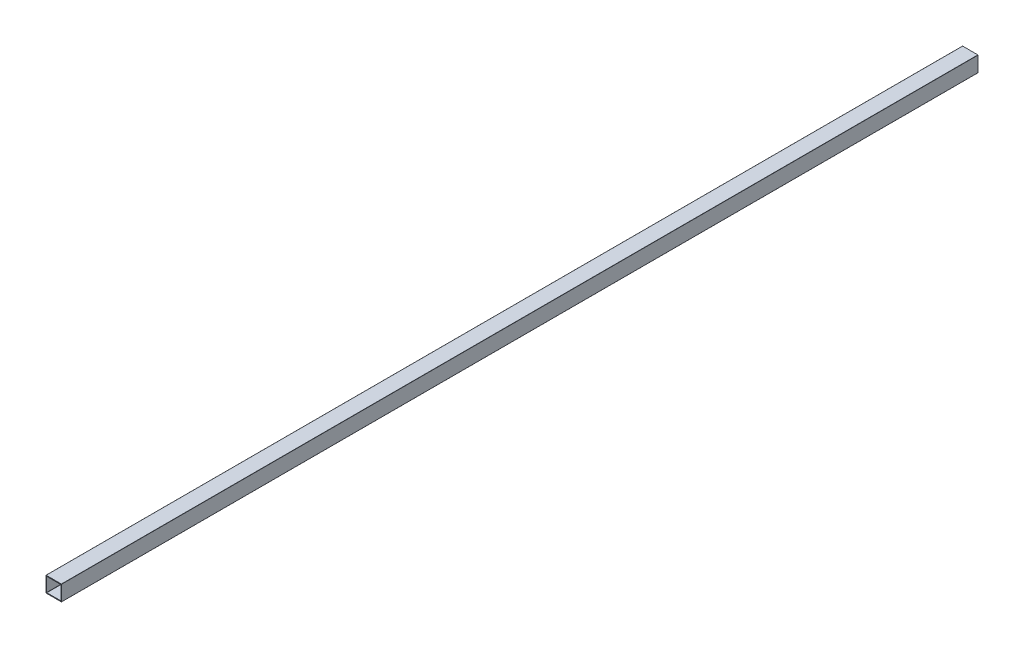
ISO-10303-21;
HEADER;
FILE_DESCRIPTION(('STEP AP214'),'2;1');
FILE_NAME('part.step','',(''),(''),'','','');
FILE_SCHEMA(('AUTOMOTIVE_DESIGN { 1 0 10303 214 1 1 1 1 }'));
ENDSEC;
DATA;
#1=APPLICATION_CONTEXT('core data for automotive mechanical design processes');
#2=APPLICATION_PROTOCOL_DEFINITION('international standard','automotive_design',2000,#1);
#3=PRODUCT_CONTEXT('',#1,'mechanical');
#4=PRODUCT('Part','Part','',(#3));
#5=PRODUCT_RELATED_PRODUCT_CATEGORY('part','',(#4));
#6=PRODUCT_DEFINITION_FORMATION('','',#4);
#7=PRODUCT_DEFINITION_CONTEXT('part definition',#1,'design');
#8=PRODUCT_DEFINITION('design','',#6,#7);
#9=PRODUCT_DEFINITION_SHAPE('','',#8);
#10=(LENGTH_UNIT() NAMED_UNIT(*) SI_UNIT(.MILLI.,.METRE.));
#11=(NAMED_UNIT(*) PLANE_ANGLE_UNIT() SI_UNIT($,.RADIAN.));
#12=(NAMED_UNIT(*) SI_UNIT($,.STERADIAN.) SOLID_ANGLE_UNIT());
#13=UNCERTAINTY_MEASURE_WITH_UNIT(LENGTH_MEASURE(1.E-05),#10,'distance_accuracy_value','');
#14=(GEOMETRIC_REPRESENTATION_CONTEXT(3) GLOBAL_UNCERTAINTY_ASSIGNED_CONTEXT((#13)) GLOBAL_UNIT_ASSIGNED_CONTEXT((#10,
#11,#12)) REPRESENTATION_CONTEXT('',''));
#15=CARTESIAN_POINT('',(0.,0.,0.));
#16=DIRECTION('',(0.,0.,1.));
#17=DIRECTION('',(1.,0.,0.));
#18=AXIS2_PLACEMENT_3D('',#15,#16,#17);
#19=CARTESIAN_POINT('',(50.8,-50.8,-6000.));
#20=DIRECTION('',(1.,0.,0.));
#21=DIRECTION('',(0.,0.,-1.));
#22=AXIS2_PLACEMENT_3D('',#19,#20,#21);
#23=PLANE('',#22);
#24=DIRECTION('',(0.,1.,0.));
#25=VECTOR('',#24,1.);
#26=CARTESIAN_POINT('',(50.8,-50.8,0.));
#27=LINE('',#26,#25);
#28=CARTESIAN_POINT('',(50.8,-49.8,0.));
#29=VERTEX_POINT('',#28);
#30=CARTESIAN_POINT('',(50.8,49.8,0.));
#31=VERTEX_POINT('',#30);
#32=EDGE_CURVE('E197',#29,#31,#27,.T.);
#33=ORIENTED_EDGE('',*,*,#32,.F.);
#34=DIRECTION('',(0.,0.,1.));
#35=VECTOR('',#34,1.);
#36=CARTESIAN_POINT('',(50.8,-49.8,-6000.));
#37=LINE('',#36,#35);
#38=CARTESIAN_POINT('',(50.8,-49.8,-6000.));
#39=VERTEX_POINT('',#38);
#40=EDGE_CURVE('E158',#29,#39,#37,.F.);
#41=ORIENTED_EDGE('',*,*,#40,.T.);
#42=DIRECTION('',(0.,1.,0.));
#43=VECTOR('',#42,1.);
#44=CARTESIAN_POINT('',(50.8,-50.8,-6000.));
#45=LINE('',#44,#43);
#46=CARTESIAN_POINT('',(50.8,49.8,-6000.));
#47=VERTEX_POINT('',#46);
#48=EDGE_CURVE('E185',#39,#47,#45,.T.);
#49=ORIENTED_EDGE('',*,*,#48,.T.);
#50=DIRECTION('',(0.,0.,1.));
#51=VECTOR('',#50,1.);
#52=CARTESIAN_POINT('',(50.8,49.8,-6000.));
#53=LINE('',#52,#51);
#54=EDGE_CURVE('E251',#47,#31,#53,.T.);
#55=ORIENTED_EDGE('',*,*,#54,.T.);
#56=EDGE_LOOP('',(#33,#41,#49,#55));
#57=FACE_BOUND('',#56,.T.);
#58=ADVANCED_FACE('F33',(#57),#23,.T.);
#59=CARTESIAN_POINT('',(-50.8,-50.8,-6000.));
#60=DIRECTION('',(0.,-1.,0.));
#61=DIRECTION('',(0.,0.,-1.));
#62=AXIS2_PLACEMENT_3D('',#59,#60,#61);
#63=PLANE('',#62);
#64=DIRECTION('',(1.,0.,0.));
#65=VECTOR('',#64,1.);
#66=CARTESIAN_POINT('',(-50.8,-50.8,0.));
#67=LINE('',#66,#65);
#68=CARTESIAN_POINT('',(-49.8,-50.8,0.));
#69=VERTEX_POINT('',#68);
#70=CARTESIAN_POINT('',(49.8,-50.8,0.));
#71=VERTEX_POINT('',#70);
#72=EDGE_CURVE('E189',#69,#71,#67,.T.);
#73=ORIENTED_EDGE('',*,*,#72,.F.);
#74=DIRECTION('',(0.,0.,1.));
#75=VECTOR('',#74,1.);
#76=CARTESIAN_POINT('',(-49.8,-50.8,-6000.));
#77=LINE('',#76,#75);
#78=CARTESIAN_POINT('',(-49.8,-50.8,-6000.));
#79=VERTEX_POINT('',#78);
#80=EDGE_CURVE('E238',#69,#79,#77,.F.);
#81=ORIENTED_EDGE('',*,*,#80,.T.);
#82=DIRECTION('',(1.,0.,0.));
#83=VECTOR('',#82,1.);
#84=CARTESIAN_POINT('',(-50.8,-50.8,-6000.));
#85=LINE('',#84,#83);
#86=CARTESIAN_POINT('',(49.8,-50.8,-6000.));
#87=VERTEX_POINT('',#86);
#88=EDGE_CURVE('E194',#79,#87,#85,.T.);
#89=ORIENTED_EDGE('',*,*,#88,.T.);
#90=DIRECTION('',(0.,0.,1.));
#91=VECTOR('',#90,1.);
#92=CARTESIAN_POINT('',(49.8,-50.8,-6000.));
#93=LINE('',#92,#91);
#94=EDGE_CURVE('E235',#87,#71,#93,.T.);
#95=ORIENTED_EDGE('',*,*,#94,.T.);
#96=EDGE_LOOP('',(#73,#81,#89,#95));
#97=FACE_BOUND('',#96,.T.);
#98=ADVANCED_FACE('F305',(#97),#63,.T.);
#99=CARTESIAN_POINT('',(-50.8,-50.8,-6000.));
#100=DIRECTION('',(-1.,0.,0.));
#101=DIRECTION('',(0.,0.,1.));
#102=AXIS2_PLACEMENT_3D('',#99,#100,#101);
#103=PLANE('',#102);
#104=DIRECTION('',(0.,-1.,0.));
#105=VECTOR('',#104,1.);
#106=CARTESIAN_POINT('',(-50.8,-50.8,-6000.));
#107=LINE('',#106,#105);
#108=CARTESIAN_POINT('',(-50.8,49.8,-6000.));
#109=VERTEX_POINT('',#108);
#110=CARTESIAN_POINT('',(-50.8,-49.8,-6000.));
#111=VERTEX_POINT('',#110);
#112=EDGE_CURVE('E191',#109,#111,#107,.T.);
#113=ORIENTED_EDGE('',*,*,#112,.T.);
#114=DIRECTION('',(0.,0.,1.));
#115=VECTOR('',#114,1.);
#116=CARTESIAN_POINT('',(-50.8,-49.8,-6000.));
#117=LINE('',#116,#115);
#118=CARTESIAN_POINT('',(-50.8,-49.8,0.));
#119=VERTEX_POINT('',#118);
#120=EDGE_CURVE('E224',#111,#119,#117,.T.);
#121=ORIENTED_EDGE('',*,*,#120,.T.);
#122=DIRECTION('',(0.,-1.,0.));
#123=VECTOR('',#122,1.);
#124=CARTESIAN_POINT('',(-50.8,-50.8,0.));
#125=LINE('',#124,#123);
#126=CARTESIAN_POINT('',(-50.8,49.8,0.));
#127=VERTEX_POINT('',#126);
#128=EDGE_CURVE('E203',#127,#119,#125,.T.);
#129=ORIENTED_EDGE('',*,*,#128,.F.);
#130=DIRECTION('',(0.,0.,1.));
#131=VECTOR('',#130,1.);
#132=CARTESIAN_POINT('',(-50.8,49.8,-6000.));
#133=LINE('',#132,#131);
#134=EDGE_CURVE('E222',#127,#109,#133,.F.);
#135=ORIENTED_EDGE('',*,*,#134,.T.);
#136=EDGE_LOOP('',(#113,#121,#129,#135));
#137=FACE_BOUND('',#136,.T.);
#138=ADVANCED_FACE('F311',(#137),#103,.T.);
#139=CARTESIAN_POINT('',(-50.8,50.8,-6000.));
#140=DIRECTION('',(0.,1.,0.));
#141=DIRECTION('',(0.,0.,1.));
#142=AXIS2_PLACEMENT_3D('',#139,#140,#141);
#143=PLANE('',#142);
#144=DIRECTION('',(-1.,0.,0.));
#145=VECTOR('',#144,1.);
#146=CARTESIAN_POINT('',(-50.8,50.8,-6000.));
#147=LINE('',#146,#145);
#148=CARTESIAN_POINT('',(49.8,50.8,-6000.));
#149=VERTEX_POINT('',#148);
#150=CARTESIAN_POINT('',(-49.8,50.8,-6000.));
#151=VERTEX_POINT('',#150);
#152=EDGE_CURVE('E188',#149,#151,#147,.T.);
#153=ORIENTED_EDGE('',*,*,#152,.T.);
#154=DIRECTION('',(0.,0.,1.));
#155=VECTOR('',#154,1.);
#156=CARTESIAN_POINT('',(-49.8,50.8,-6000.));
#157=LINE('',#156,#155);
#158=CARTESIAN_POINT('',(-49.8,50.8,0.));
#159=VERTEX_POINT('',#158);
#160=EDGE_CURVE('E248',#151,#159,#157,.T.);
#161=ORIENTED_EDGE('',*,*,#160,.T.);
#162=DIRECTION('',(-1.,0.,0.));
#163=VECTOR('',#162,1.);
#164=CARTESIAN_POINT('',(-50.8,50.8,0.));
#165=LINE('',#164,#163);
#166=CARTESIAN_POINT('',(49.8,50.8,0.));
#167=VERTEX_POINT('',#166);
#168=EDGE_CURVE('E200',#167,#159,#165,.T.);
#169=ORIENTED_EDGE('',*,*,#168,.F.);
#170=DIRECTION('',(0.,0.,1.));
#171=VECTOR('',#170,1.);
#172=CARTESIAN_POINT('',(49.8,50.8,-6000.));
#173=LINE('',#172,#171);
#174=EDGE_CURVE('E55',#167,#149,#173,.F.);
#175=ORIENTED_EDGE('',*,*,#174,.T.);
#176=EDGE_LOOP('',(#153,#161,#169,#175));
#177=FACE_BOUND('',#176,.T.);
#178=ADVANCED_FACE('F316',(#177),#143,.T.);
#179=CARTESIAN_POINT('',(0.,0.,-6000.));
#180=DIRECTION('',(0.,0.,-1.));
#181=DIRECTION('',(-1.,0.,0.));
#182=AXIS2_PLACEMENT_3D('',#179,#180,#181);
#183=PLANE('',#182);
#184=DIRECTION('',(0.,-1.,0.));
#185=VECTOR('',#184,1.);
#186=CARTESIAN_POINT('',(-46.25,-46.25,-6000.));
#187=LINE('',#186,#185);
#188=CARTESIAN_POINT('',(-46.25,45.25,-6000.));
#189=VERTEX_POINT('',#188);
#190=CARTESIAN_POINT('',(-46.25,-45.25,-6000.));
#191=VERTEX_POINT('',#190);
#192=EDGE_CURVE('E167',#189,#191,#187,.T.);
#193=ORIENTED_EDGE('',*,*,#192,.T.);
#194=CARTESIAN_POINT('',(-45.25,-45.25,-6000.));
#195=DIRECTION('',(0.,0.,-1.));
#196=DIRECTION('',(-1.,0.,0.));
#197=AXIS2_PLACEMENT_3D('',#194,#195,#196);
#198=CIRCLE('',#197,1.);
#199=CARTESIAN_POINT('',(-45.25,-46.25,-6000.));
#200=VERTEX_POINT('',#199);
#201=EDGE_CURVE('E11',#191,#200,#198,.F.);
#202=ORIENTED_EDGE('',*,*,#201,.T.);
#203=DIRECTION('',(1.,0.,0.));
#204=VECTOR('',#203,1.);
#205=CARTESIAN_POINT('',(-46.25,-46.25,-6000.));
#206=LINE('',#205,#204);
#207=CARTESIAN_POINT('',(45.25,-46.25,-6000.));
#208=VERTEX_POINT('',#207);
#209=EDGE_CURVE('E175',#200,#208,#206,.T.);
#210=ORIENTED_EDGE('',*,*,#209,.T.);
#211=CARTESIAN_POINT('',(45.25,-45.25,-6000.));
#212=DIRECTION('',(0.,0.,-1.));
#213=DIRECTION('',(-1.,0.,0.));
#214=AXIS2_PLACEMENT_3D('',#211,#212,#213);
#215=CIRCLE('',#214,1.);
#216=CARTESIAN_POINT('',(46.25,-45.25,-6000.));
#217=VERTEX_POINT('',#216);
#218=EDGE_CURVE('E262',#208,#217,#215,.F.);
#219=ORIENTED_EDGE('',*,*,#218,.T.);
#220=DIRECTION('',(0.,1.,0.));
#221=VECTOR('',#220,1.);
#222=CARTESIAN_POINT('',(46.25,-46.25,-6000.));
#223=LINE('',#222,#221);
#224=CARTESIAN_POINT('',(46.25,45.25,-6000.));
#225=VERTEX_POINT('',#224);
#226=EDGE_CURVE('E179',#217,#225,#223,.T.);
#227=ORIENTED_EDGE('',*,*,#226,.T.);
#228=CARTESIAN_POINT('',(45.25,45.25,-6000.));
#229=DIRECTION('',(0.,0.,-1.));
#230=DIRECTION('',(-1.,0.,0.));
#231=AXIS2_PLACEMENT_3D('',#228,#229,#230);
#232=CIRCLE('',#231,1.);
#233=CARTESIAN_POINT('',(45.25,46.25,-6000.));
#234=VERTEX_POINT('',#233);
#235=EDGE_CURVE('E258',#225,#234,#232,.F.);
#236=ORIENTED_EDGE('',*,*,#235,.T.);
#237=DIRECTION('',(-1.,0.,0.));
#238=VECTOR('',#237,1.);
#239=CARTESIAN_POINT('',(-46.25,46.25,-6000.));
#240=LINE('',#239,#238);
#241=CARTESIAN_POINT('',(-45.25,46.25,-6000.));
#242=VERTEX_POINT('',#241);
#243=EDGE_CURVE('E277',#234,#242,#240,.T.);
#244=ORIENTED_EDGE('',*,*,#243,.T.);
#245=CARTESIAN_POINT('',(-45.25,45.25,-6000.));
#246=DIRECTION('',(0.,0.,-1.));
#247=DIRECTION('',(-1.,0.,0.));
#248=AXIS2_PLACEMENT_3D('',#245,#246,#247);
#249=CIRCLE('',#248,1.);
#250=EDGE_CURVE('E157',#242,#189,#249,.F.);
#251=ORIENTED_EDGE('',*,*,#250,.T.);
#252=EDGE_LOOP('',(#193,#202,#210,#219,#227,#236,#244,#251));
#253=FACE_BOUND('',#252,.T.);
#254=ORIENTED_EDGE('',*,*,#88,.F.);
#255=CARTESIAN_POINT('',(-49.8,-49.8,-6000.));
#256=DIRECTION('',(0.,0.,-1.));
#257=DIRECTION('',(-1.,0.,0.));
#258=AXIS2_PLACEMENT_3D('',#255,#256,#257);
#259=CIRCLE('',#258,1.);
#260=EDGE_CURVE('E245',#79,#111,#259,.T.);
#261=ORIENTED_EDGE('',*,*,#260,.T.);
#262=ORIENTED_EDGE('',*,*,#112,.F.);
#263=CARTESIAN_POINT('',(-49.8,49.8,-6000.));
#264=DIRECTION('',(0.,0.,-1.));
#265=DIRECTION('',(-1.,0.,0.));
#266=AXIS2_PLACEMENT_3D('',#263,#264,#265);
#267=CIRCLE('',#266,1.);
#268=EDGE_CURVE('E48',#109,#151,#267,.T.);
#269=ORIENTED_EDGE('',*,*,#268,.T.);
#270=ORIENTED_EDGE('',*,*,#152,.F.);
#271=CARTESIAN_POINT('',(49.8,49.8,-6000.));
#272=DIRECTION('',(0.,0.,-1.));
#273=DIRECTION('',(-1.,0.,0.));
#274=AXIS2_PLACEMENT_3D('',#271,#272,#273);
#275=CIRCLE('',#274,1.);
#276=EDGE_CURVE('E240',#149,#47,#275,.T.);
#277=ORIENTED_EDGE('',*,*,#276,.T.);
#278=ORIENTED_EDGE('',*,*,#48,.F.);
#279=CARTESIAN_POINT('',(49.8,-49.8,-6000.));
#280=DIRECTION('',(0.,0.,-1.));
#281=DIRECTION('',(-1.,0.,0.));
#282=AXIS2_PLACEMENT_3D('',#279,#280,#281);
#283=CIRCLE('',#282,1.);
#284=EDGE_CURVE('E242',#39,#87,#283,.T.);
#285=ORIENTED_EDGE('',*,*,#284,.T.);
#286=EDGE_LOOP('',(#254,#261,#262,#269,#270,#277,#278,#285));
#287=FACE_BOUND('',#286,.T.);
#288=ADVANCED_FACE('F267',(#253,#287),#183,.T.);
#289=CARTESIAN_POINT('',(0.,0.,0.));
#290=DIRECTION('',(0.,0.,-1.));
#291=DIRECTION('',(-1.,0.,0.));
#292=AXIS2_PLACEMENT_3D('',#289,#290,#291);
#293=PLANE('',#292);
#294=DIRECTION('',(0.,1.,0.));
#295=VECTOR('',#294,1.);
#296=CARTESIAN_POINT('',(46.25,-46.25,0.));
#297=LINE('',#296,#295);
#298=CARTESIAN_POINT('',(46.25,-45.25,0.));
#299=VERTEX_POINT('',#298);
#300=CARTESIAN_POINT('',(46.25,45.25,0.));
#301=VERTEX_POINT('',#300);
#302=EDGE_CURVE('E181',#299,#301,#297,.T.);
#303=ORIENTED_EDGE('',*,*,#302,.F.);
#304=CARTESIAN_POINT('',(45.25,-45.25,0.));
#305=DIRECTION('',(0.,0.,-1.));
#306=DIRECTION('',(-1.,0.,0.));
#307=AXIS2_PLACEMENT_3D('',#304,#305,#306);
#308=CIRCLE('',#307,1.);
#309=CARTESIAN_POINT('',(45.25,-46.25,0.));
#310=VERTEX_POINT('',#309);
#311=EDGE_CURVE('E260',#299,#310,#308,.T.);
#312=ORIENTED_EDGE('',*,*,#311,.T.);
#313=DIRECTION('',(1.,0.,0.));
#314=VECTOR('',#313,1.);
#315=CARTESIAN_POINT('',(-46.25,-46.25,0.));
#316=LINE('',#315,#314);
#317=CARTESIAN_POINT('',(-45.25,-46.25,0.));
#318=VERTEX_POINT('',#317);
#319=EDGE_CURVE('E281',#318,#310,#316,.T.);
#320=ORIENTED_EDGE('',*,*,#319,.F.);
#321=CARTESIAN_POINT('',(-45.25,-45.25,0.));
#322=DIRECTION('',(0.,0.,-1.));
#323=DIRECTION('',(-1.,0.,0.));
#324=AXIS2_PLACEMENT_3D('',#321,#322,#323);
#325=CIRCLE('',#324,1.);
#326=CARTESIAN_POINT('',(-46.25,-45.25,0.));
#327=VERTEX_POINT('',#326);
#328=EDGE_CURVE('E41',#318,#327,#325,.T.);
#329=ORIENTED_EDGE('',*,*,#328,.T.);
#330=DIRECTION('',(0.,-1.,0.));
#331=VECTOR('',#330,1.);
#332=CARTESIAN_POINT('',(-46.25,-46.25,0.));
#333=LINE('',#332,#331);
#334=CARTESIAN_POINT('',(-46.25,45.25,0.));
#335=VERTEX_POINT('',#334);
#336=EDGE_CURVE('E164',#335,#327,#333,.T.);
#337=ORIENTED_EDGE('',*,*,#336,.F.);
#338=CARTESIAN_POINT('',(-45.25,45.25,0.));
#339=DIRECTION('',(0.,0.,-1.));
#340=DIRECTION('',(-1.,0.,0.));
#341=AXIS2_PLACEMENT_3D('',#338,#339,#340);
#342=CIRCLE('',#341,1.);
#343=CARTESIAN_POINT('',(-45.25,46.25,0.));
#344=VERTEX_POINT('',#343);
#345=EDGE_CURVE('E147',#335,#344,#342,.T.);
#346=ORIENTED_EDGE('',*,*,#345,.T.);
#347=DIRECTION('',(-1.,0.,0.));
#348=VECTOR('',#347,1.);
#349=CARTESIAN_POINT('',(-46.25,46.25,0.));
#350=LINE('',#349,#348);
#351=CARTESIAN_POINT('',(45.25,46.25,0.));
#352=VERTEX_POINT('',#351);
#353=EDGE_CURVE('E176',#352,#344,#350,.T.);
#354=ORIENTED_EDGE('',*,*,#353,.F.);
#355=CARTESIAN_POINT('',(45.25,45.25,0.));
#356=DIRECTION('',(0.,0.,-1.));
#357=DIRECTION('',(-1.,0.,0.));
#358=AXIS2_PLACEMENT_3D('',#355,#356,#357);
#359=CIRCLE('',#358,1.);
#360=EDGE_CURVE('E256',#352,#301,#359,.T.);
#361=ORIENTED_EDGE('',*,*,#360,.T.);
#362=EDGE_LOOP('',(#303,#312,#320,#329,#337,#346,#354,#361));
#363=FACE_BOUND('',#362,.T.);
#364=ORIENTED_EDGE('',*,*,#128,.T.);
#365=CARTESIAN_POINT('',(-49.8,-49.8,0.));
#366=DIRECTION('',(0.,0.,-1.));
#367=DIRECTION('',(-1.,0.,0.));
#368=AXIS2_PLACEMENT_3D('',#365,#366,#367);
#369=CIRCLE('',#368,1.);
#370=EDGE_CURVE('E233',#119,#69,#369,.F.);
#371=ORIENTED_EDGE('',*,*,#370,.T.);
#372=ORIENTED_EDGE('',*,*,#72,.T.);
#373=CARTESIAN_POINT('',(49.8,-49.8,0.));
#374=DIRECTION('',(0.,0.,-1.));
#375=DIRECTION('',(-1.,0.,0.));
#376=AXIS2_PLACEMENT_3D('',#373,#374,#375);
#377=CIRCLE('',#376,1.);
#378=EDGE_CURVE('E229',#71,#29,#377,.F.);
#379=ORIENTED_EDGE('',*,*,#378,.T.);
#380=ORIENTED_EDGE('',*,*,#32,.T.);
#381=CARTESIAN_POINT('',(49.8,49.8,0.));
#382=DIRECTION('',(0.,0.,-1.));
#383=DIRECTION('',(-1.,0.,0.));
#384=AXIS2_PLACEMENT_3D('',#381,#382,#383);
#385=CIRCLE('',#384,1.);
#386=EDGE_CURVE('E227',#31,#167,#385,.F.);
#387=ORIENTED_EDGE('',*,*,#386,.T.);
#388=ORIENTED_EDGE('',*,*,#168,.T.);
#389=CARTESIAN_POINT('',(-49.8,49.8,0.));
#390=DIRECTION('',(0.,0.,-1.));
#391=DIRECTION('',(-1.,0.,0.));
#392=AXIS2_PLACEMENT_3D('',#389,#390,#391);
#393=CIRCLE('',#392,1.);
#394=EDGE_CURVE('E231',#159,#127,#393,.F.);
#395=ORIENTED_EDGE('',*,*,#394,.T.);
#396=EDGE_LOOP('',(#364,#371,#372,#379,#380,#387,#388,#395));
#397=FACE_BOUND('',#396,.T.);
#398=ADVANCED_FACE('F172',(#363,#397),#293,.F.);
#399=CARTESIAN_POINT('',(-46.25,-46.25,-6000.));
#400=DIRECTION('',(0.,-1.,0.));
#401=DIRECTION('',(0.,0.,-1.));
#402=AXIS2_PLACEMENT_3D('',#399,#400,#401);
#403=PLANE('',#402);
#404=ORIENTED_EDGE('',*,*,#319,.T.);
#405=DIRECTION('',(0.,0.,1.));
#406=VECTOR('',#405,1.);
#407=CARTESIAN_POINT('',(45.25,-46.25,-6000.));
#408=LINE('',#407,#406);
#409=EDGE_CURVE('E220',#310,#208,#408,.F.);
#410=ORIENTED_EDGE('',*,*,#409,.T.);
#411=ORIENTED_EDGE('',*,*,#209,.F.);
#412=DIRECTION('',(0.,0.,1.));
#413=VECTOR('',#412,1.);
#414=CARTESIAN_POINT('',(-45.25,-46.25,0.));
#415=LINE('',#414,#413);
#416=EDGE_CURVE('E217',#200,#318,#415,.T.);
#417=ORIENTED_EDGE('',*,*,#416,.T.);
#418=EDGE_LOOP('',(#404,#410,#411,#417));
#419=FACE_BOUND('',#418,.T.);
#420=ADVANCED_FACE('F283',(#419),#403,.F.);
#421=CARTESIAN_POINT('',(-46.25,-46.25,-6000.));
#422=DIRECTION('',(-1.,0.,0.));
#423=DIRECTION('',(0.,0.,1.));
#424=AXIS2_PLACEMENT_3D('',#421,#422,#423);
#425=PLANE('',#424);
#426=ORIENTED_EDGE('',*,*,#192,.F.);
#427=DIRECTION('',(0.,0.,1.));
#428=VECTOR('',#427,1.);
#429=CARTESIAN_POINT('',(-46.25,45.25,0.));
#430=LINE('',#429,#428);
#431=EDGE_CURVE('E151',#189,#335,#430,.T.);
#432=ORIENTED_EDGE('',*,*,#431,.T.);
#433=ORIENTED_EDGE('',*,*,#336,.T.);
#434=DIRECTION('',(0.,0.,1.));
#435=VECTOR('',#434,1.);
#436=CARTESIAN_POINT('',(-46.25,-45.25,-6000.));
#437=LINE('',#436,#435);
#438=EDGE_CURVE('E169',#327,#191,#437,.F.);
#439=ORIENTED_EDGE('',*,*,#438,.T.);
#440=EDGE_LOOP('',(#426,#432,#433,#439));
#441=FACE_BOUND('',#440,.T.);
#442=ADVANCED_FACE('F163',(#441),#425,.F.);
#443=CARTESIAN_POINT('',(-46.25,46.25,-6000.));
#444=DIRECTION('',(0.,1.,0.));
#445=DIRECTION('',(0.,0.,1.));
#446=AXIS2_PLACEMENT_3D('',#443,#444,#445);
#447=PLANE('',#446);
#448=ORIENTED_EDGE('',*,*,#353,.T.);
#449=DIRECTION('',(0.,0.,1.));
#450=VECTOR('',#449,1.);
#451=CARTESIAN_POINT('',(-45.25,46.25,-6000.));
#452=LINE('',#451,#450);
#453=EDGE_CURVE('E152',#344,#242,#452,.F.);
#454=ORIENTED_EDGE('',*,*,#453,.T.);
#455=ORIENTED_EDGE('',*,*,#243,.F.);
#456=DIRECTION('',(0.,0.,1.));
#457=VECTOR('',#456,1.);
#458=CARTESIAN_POINT('',(45.25,46.25,0.));
#459=LINE('',#458,#457);
#460=EDGE_CURVE('E168',#234,#352,#459,.T.);
#461=ORIENTED_EDGE('',*,*,#460,.T.);
#462=EDGE_LOOP('',(#448,#454,#455,#461));
#463=FACE_BOUND('',#462,.T.);
#464=ADVANCED_FACE('F292',(#463),#447,.F.);
#465=CARTESIAN_POINT('',(46.25,-46.25,-6000.));
#466=DIRECTION('',(1.,0.,0.));
#467=DIRECTION('',(0.,0.,-1.));
#468=AXIS2_PLACEMENT_3D('',#465,#466,#467);
#469=PLANE('',#468);
#470=ORIENTED_EDGE('',*,*,#302,.T.);
#471=DIRECTION('',(0.,0.,1.));
#472=VECTOR('',#471,1.);
#473=CARTESIAN_POINT('',(46.25,45.25,-6000.));
#474=LINE('',#473,#472);
#475=EDGE_CURVE('E215',#301,#225,#474,.F.);
#476=ORIENTED_EDGE('',*,*,#475,.T.);
#477=ORIENTED_EDGE('',*,*,#226,.F.);
#478=DIRECTION('',(0.,0.,1.));
#479=VECTOR('',#478,1.);
#480=CARTESIAN_POINT('',(46.25,-45.25,0.));
#481=LINE('',#480,#479);
#482=EDGE_CURVE('E212',#217,#299,#481,.T.);
#483=ORIENTED_EDGE('',*,*,#482,.T.);
#484=EDGE_LOOP('',(#470,#476,#477,#483));
#485=FACE_BOUND('',#484,.T.);
#486=ADVANCED_FACE('F275',(#485),#469,.F.);
#487=CARTESIAN_POINT('',(-45.25,45.25,-6000.));
#488=DIRECTION('',(0.,0.,-1.));
#489=DIRECTION('',(-1.,0.,0.));
#490=AXIS2_PLACEMENT_3D('',#487,#488,#489);
#491=CYLINDRICAL_SURFACE('',#490,1.);
#492=ORIENTED_EDGE('',*,*,#250,.F.);
#493=ORIENTED_EDGE('',*,*,#453,.F.);
#494=ORIENTED_EDGE('',*,*,#345,.F.);
#495=ORIENTED_EDGE('',*,*,#431,.F.);
#496=EDGE_LOOP('',(#492,#493,#494,#495));
#497=FACE_BOUND('',#496,.T.);
#498=ADVANCED_FACE('F150',(#497),#491,.F.);
#499=CARTESIAN_POINT('',(45.25,45.25,-6000.));
#500=DIRECTION('',(0.,0.,-1.));
#501=DIRECTION('',(-1.,0.,0.));
#502=AXIS2_PLACEMENT_3D('',#499,#500,#501);
#503=CYLINDRICAL_SURFACE('',#502,1.);
#504=ORIENTED_EDGE('',*,*,#235,.F.);
#505=ORIENTED_EDGE('',*,*,#475,.F.);
#506=ORIENTED_EDGE('',*,*,#360,.F.);
#507=ORIENTED_EDGE('',*,*,#460,.F.);
#508=EDGE_LOOP('',(#504,#505,#506,#507));
#509=FACE_BOUND('',#508,.T.);
#510=ADVANCED_FACE('F294',(#509),#503,.F.);
#511=CARTESIAN_POINT('',(45.25,-45.25,-6000.));
#512=DIRECTION('',(0.,0.,-1.));
#513=DIRECTION('',(-1.,0.,0.));
#514=AXIS2_PLACEMENT_3D('',#511,#512,#513);
#515=CYLINDRICAL_SURFACE('',#514,1.);
#516=ORIENTED_EDGE('',*,*,#218,.F.);
#517=ORIENTED_EDGE('',*,*,#409,.F.);
#518=ORIENTED_EDGE('',*,*,#311,.F.);
#519=ORIENTED_EDGE('',*,*,#482,.F.);
#520=EDGE_LOOP('',(#516,#517,#518,#519));
#521=FACE_BOUND('',#520,.T.);
#522=ADVANCED_FACE('F279',(#521),#515,.F.);
#523=CARTESIAN_POINT('',(-49.8,-49.8,-6000.));
#524=DIRECTION('',(0.,0.,1.));
#525=DIRECTION('',(1.,0.,0.));
#526=AXIS2_PLACEMENT_3D('',#523,#524,#525);
#527=CYLINDRICAL_SURFACE('',#526,1.);
#528=ORIENTED_EDGE('',*,*,#260,.F.);
#529=ORIENTED_EDGE('',*,*,#80,.F.);
#530=ORIENTED_EDGE('',*,*,#370,.F.);
#531=ORIENTED_EDGE('',*,*,#120,.F.);
#532=EDGE_LOOP('',(#528,#529,#530,#531));
#533=FACE_BOUND('',#532,.T.);
#534=ADVANCED_FACE('F301',(#533),#527,.T.);
#535=CARTESIAN_POINT('',(-49.8,49.8,-6000.));
#536=DIRECTION('',(0.,0.,1.));
#537=DIRECTION('',(1.,0.,0.));
#538=AXIS2_PLACEMENT_3D('',#535,#536,#537);
#539=CYLINDRICAL_SURFACE('',#538,1.);
#540=ORIENTED_EDGE('',*,*,#268,.F.);
#541=ORIENTED_EDGE('',*,*,#134,.F.);
#542=ORIENTED_EDGE('',*,*,#394,.F.);
#543=ORIENTED_EDGE('',*,*,#160,.F.);
#544=EDGE_LOOP('',(#540,#541,#542,#543));
#545=FACE_BOUND('',#544,.T.);
#546=ADVANCED_FACE('F368',(#545),#539,.T.);
#547=CARTESIAN_POINT('',(-45.25,-45.25,-6000.));
#548=DIRECTION('',(0.,0.,-1.));
#549=DIRECTION('',(-1.,0.,0.));
#550=AXIS2_PLACEMENT_3D('',#547,#548,#549);
#551=CYLINDRICAL_SURFACE('',#550,1.);
#552=ORIENTED_EDGE('',*,*,#201,.F.);
#553=ORIENTED_EDGE('',*,*,#438,.F.);
#554=ORIENTED_EDGE('',*,*,#328,.F.);
#555=ORIENTED_EDGE('',*,*,#416,.F.);
#556=EDGE_LOOP('',(#552,#553,#554,#555));
#557=FACE_BOUND('',#556,.T.);
#558=ADVANCED_FACE('F378',(#557),#551,.F.);
#559=CARTESIAN_POINT('',(49.8,-49.8,-6000.));
#560=DIRECTION('',(0.,0.,1.));
#561=DIRECTION('',(1.,0.,0.));
#562=AXIS2_PLACEMENT_3D('',#559,#560,#561);
#563=CYLINDRICAL_SURFACE('',#562,1.);
#564=ORIENTED_EDGE('',*,*,#284,.F.);
#565=ORIENTED_EDGE('',*,*,#40,.F.);
#566=ORIENTED_EDGE('',*,*,#378,.F.);
#567=ORIENTED_EDGE('',*,*,#94,.F.);
#568=EDGE_LOOP('',(#564,#565,#566,#567));
#569=FACE_BOUND('',#568,.T.);
#570=ADVANCED_FACE('F388',(#569),#563,.T.);
#571=CARTESIAN_POINT('',(49.8,49.8,-6000.));
#572=DIRECTION('',(0.,0.,1.));
#573=DIRECTION('',(1.,0.,0.));
#574=AXIS2_PLACEMENT_3D('',#571,#572,#573);
#575=CYLINDRICAL_SURFACE('',#574,1.);
#576=ORIENTED_EDGE('',*,*,#276,.F.);
#577=ORIENTED_EDGE('',*,*,#174,.F.);
#578=ORIENTED_EDGE('',*,*,#386,.F.);
#579=ORIENTED_EDGE('',*,*,#54,.F.);
#580=EDGE_LOOP('',(#576,#577,#578,#579));
#581=FACE_BOUND('',#580,.T.);
#582=ADVANCED_FACE('F35',(#581),#575,.T.);
#583=CLOSED_SHELL('',(#58,#98,#138,#178,#288,#398,#420,#442,#464,#486,#498,#510,#522,#534,#546,
#558,#570,#582));
#584=MANIFOLD_SOLID_BREP('B2',#583);
#585=ADVANCED_BREP_SHAPE_REPRESENTATION('',(#18,#584),#14);
#586=SHAPE_DEFINITION_REPRESENTATION(#9,#585);
ENDSEC;
END-ISO-10303-21;
